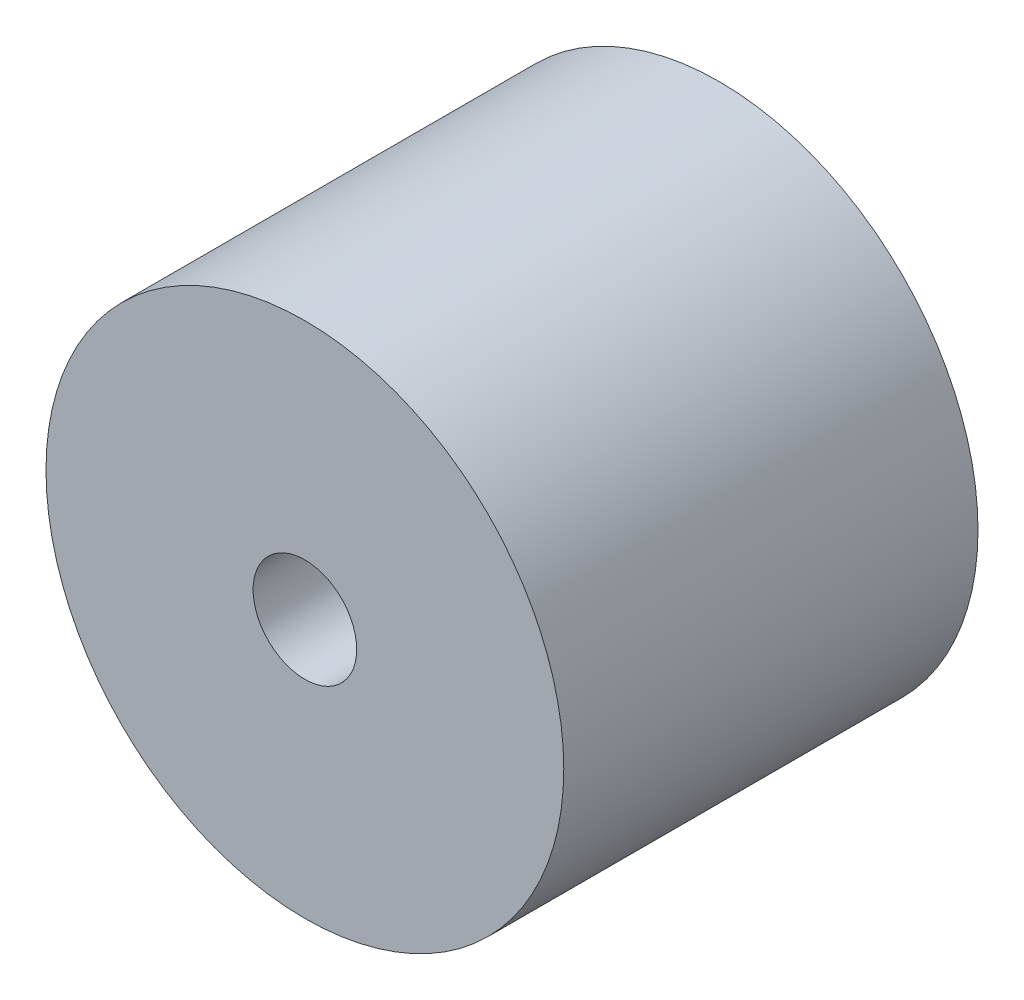
ISO-10303-21;
HEADER;
FILE_DESCRIPTION(('STEP AP214'),'2;1');
FILE_NAME('part.step','',(''),(''),'','','');
FILE_SCHEMA(('AUTOMOTIVE_DESIGN { 1 0 10303 214 1 1 1 1 }'));
ENDSEC;
DATA;
#1=APPLICATION_CONTEXT('core data for automotive mechanical design processes');
#2=APPLICATION_PROTOCOL_DEFINITION('international standard','automotive_design',2000,#1);
#3=PRODUCT_CONTEXT('',#1,'mechanical');
#4=PRODUCT('Part','Part','',(#3));
#5=PRODUCT_RELATED_PRODUCT_CATEGORY('part','',(#4));
#6=PRODUCT_DEFINITION_FORMATION('','',#4);
#7=PRODUCT_DEFINITION_CONTEXT('part definition',#1,'design');
#8=PRODUCT_DEFINITION('design','',#6,#7);
#9=PRODUCT_DEFINITION_SHAPE('','',#8);
#10=(LENGTH_UNIT() NAMED_UNIT(*) SI_UNIT(.MILLI.,.METRE.));
#11=(NAMED_UNIT(*) PLANE_ANGLE_UNIT() SI_UNIT($,.RADIAN.));
#12=(NAMED_UNIT(*) SI_UNIT($,.STERADIAN.) SOLID_ANGLE_UNIT());
#13=UNCERTAINTY_MEASURE_WITH_UNIT(LENGTH_MEASURE(1.E-05),#10,'distance_accuracy_value','');
#14=(GEOMETRIC_REPRESENTATION_CONTEXT(3) GLOBAL_UNCERTAINTY_ASSIGNED_CONTEXT((#13)) GLOBAL_UNIT_ASSIGNED_CONTEXT((#10,
#11,#12)) REPRESENTATION_CONTEXT('',''));
#15=CARTESIAN_POINT('',(0.,0.,0.));
#16=DIRECTION('',(0.,0.,1.));
#17=DIRECTION('',(1.,0.,0.));
#18=AXIS2_PLACEMENT_3D('',#15,#16,#17);
#19=CARTESIAN_POINT('',(0.,0.,16.));
#20=DIRECTION('',(0.,0.,1.));
#21=DIRECTION('',(1.,0.,0.));
#22=AXIS2_PLACEMENT_3D('',#19,#20,#21);
#23=PLANE('',#22);
#24=CARTESIAN_POINT('',(0.,0.,16.));
#25=DIRECTION('',(0.,0.,1.));
#26=DIRECTION('',(1.,0.,0.));
#27=AXIS2_PLACEMENT_3D('',#24,#25,#26);
#28=CIRCLE('',#27,20.);
#29=CARTESIAN_POINT('',(20.,0.,16.));
#30=VERTEX_POINT('',#29);
#31=EDGE_CURVE('E10',#30,#30,#28,.T.);
#32=ORIENTED_EDGE('',*,*,#31,.T.);
#33=EDGE_LOOP('',(#32));
#34=FACE_BOUND('',#33,.T.);
#35=CARTESIAN_POINT('',(0.,0.,16.));
#36=DIRECTION('',(0.,0.,1.));
#37=DIRECTION('',(1.,0.,0.));
#38=AXIS2_PLACEMENT_3D('',#35,#36,#37);
#39=CIRCLE('',#38,4.);
#40=CARTESIAN_POINT('',(4.,0.,16.));
#41=VERTEX_POINT('',#40);
#42=EDGE_CURVE('E42',#41,#41,#39,.T.);
#43=ORIENTED_EDGE('',*,*,#42,.F.);
#44=EDGE_LOOP('',(#43));
#45=FACE_BOUND('',#44,.T.);
#46=ADVANCED_FACE('F31',(#34,#45),#23,.T.);
#47=CARTESIAN_POINT('',(0.,0.,-16.));
#48=DIRECTION('',(0.,0.,1.));
#49=DIRECTION('',(1.,0.,0.));
#50=AXIS2_PLACEMENT_3D('',#47,#48,#49);
#51=PLANE('',#50);
#52=CARTESIAN_POINT('',(0.,0.,-16.));
#53=DIRECTION('',(0.,0.,1.));
#54=DIRECTION('',(1.,0.,0.));
#55=AXIS2_PLACEMENT_3D('',#52,#53,#54);
#56=CIRCLE('',#55,20.);
#57=CARTESIAN_POINT('',(20.,0.,-16.));
#58=VERTEX_POINT('',#57);
#59=EDGE_CURVE('E35',#58,#58,#56,.T.);
#60=ORIENTED_EDGE('',*,*,#59,.F.);
#61=EDGE_LOOP('',(#60));
#62=FACE_BOUND('',#61,.T.);
#63=CARTESIAN_POINT('',(0.,0.,-16.));
#64=DIRECTION('',(0.,0.,1.));
#65=DIRECTION('',(1.,0.,0.));
#66=AXIS2_PLACEMENT_3D('',#63,#64,#65);
#67=CIRCLE('',#66,4.);
#68=CARTESIAN_POINT('',(4.,0.,-16.));
#69=VERTEX_POINT('',#68);
#70=EDGE_CURVE('E44',#69,#69,#67,.T.);
#71=ORIENTED_EDGE('',*,*,#70,.T.);
#72=EDGE_LOOP('',(#71));
#73=FACE_BOUND('',#72,.T.);
#74=ADVANCED_FACE('F54',(#62,#73),#51,.F.);
#75=CARTESIAN_POINT('',(0.,0.,16.));
#76=DIRECTION('',(0.,0.,-1.));
#77=DIRECTION('',(-1.,0.,0.));
#78=AXIS2_PLACEMENT_3D('',#75,#76,#77);
#79=CYLINDRICAL_SURFACE('',#78,20.);
#80=ORIENTED_EDGE('',*,*,#31,.F.);
#81=EDGE_LOOP('',(#80));
#82=FACE_BOUND('',#81,.T.);
#83=ORIENTED_EDGE('',*,*,#59,.T.);
#84=EDGE_LOOP('',(#83));
#85=FACE_BOUND('',#84,.T.);
#86=ADVANCED_FACE('F33',(#82,#85),#79,.T.);
#87=CARTESIAN_POINT('',(0.,0.,16.));
#88=DIRECTION('',(0.,0.,-1.));
#89=DIRECTION('',(-1.,0.,0.));
#90=AXIS2_PLACEMENT_3D('',#87,#88,#89);
#91=CYLINDRICAL_SURFACE('',#90,4.);
#92=ORIENTED_EDGE('',*,*,#42,.T.);
#93=EDGE_LOOP('',(#92));
#94=FACE_BOUND('',#93,.T.);
#95=ORIENTED_EDGE('',*,*,#70,.F.);
#96=EDGE_LOOP('',(#95));
#97=FACE_BOUND('',#96,.T.);
#98=ADVANCED_FACE('F50',(#94,#97),#91,.F.);
#99=CLOSED_SHELL('',(#46,#74,#86,#98));
#100=MANIFOLD_SOLID_BREP('B2',#99);
#101=ADVANCED_BREP_SHAPE_REPRESENTATION('',(#18,#100),#14);
#102=SHAPE_DEFINITION_REPRESENTATION(#9,#101);
ENDSEC;
END-ISO-10303-21;
